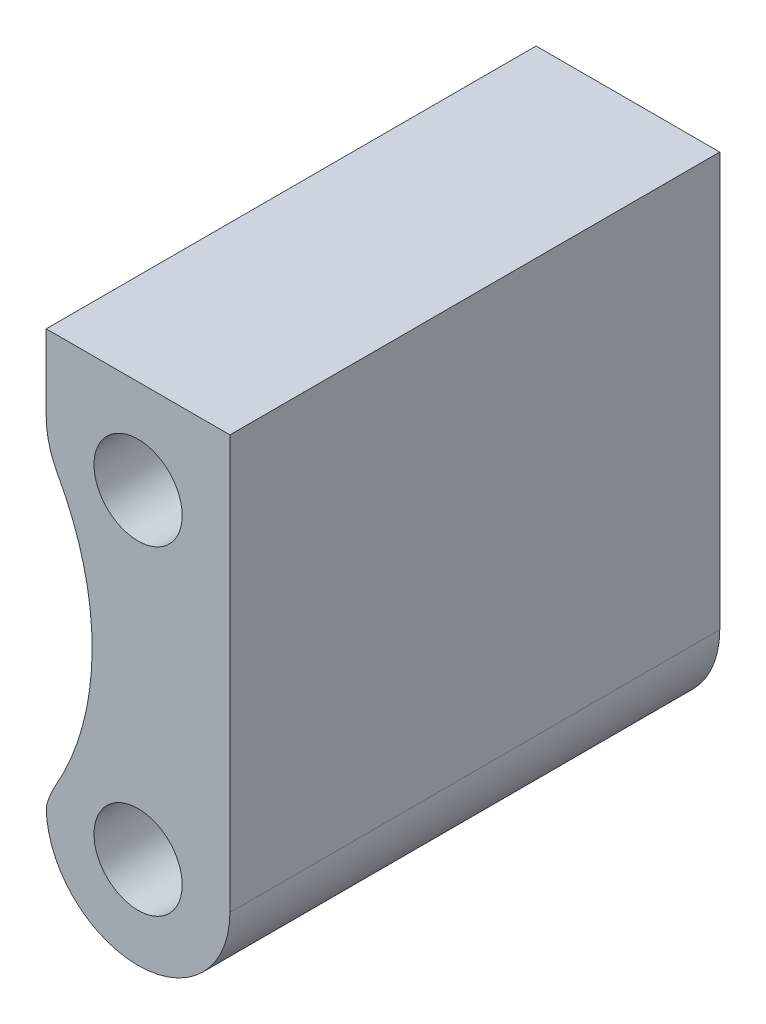
ISO-10303-21;
HEADER;
FILE_DESCRIPTION(('STEP AP214'),'2;1');
FILE_NAME('part.step','',(''),(''),'','','');
FILE_SCHEMA(('AUTOMOTIVE_DESIGN { 1 0 10303 214 1 1 1 1 }'));
ENDSEC;
DATA;
#1=APPLICATION_CONTEXT('core data for automotive mechanical design processes');
#2=APPLICATION_PROTOCOL_DEFINITION('international standard','automotive_design',2000,#1);
#3=PRODUCT_CONTEXT('',#1,'mechanical');
#4=PRODUCT('Part','Part','',(#3));
#5=PRODUCT_RELATED_PRODUCT_CATEGORY('part','',(#4));
#6=PRODUCT_DEFINITION_FORMATION('','',#4);
#7=PRODUCT_DEFINITION_CONTEXT('part definition',#1,'design');
#8=PRODUCT_DEFINITION('design','',#6,#7);
#9=PRODUCT_DEFINITION_SHAPE('','',#8);
#10=(LENGTH_UNIT() NAMED_UNIT(*) SI_UNIT(.MILLI.,.METRE.));
#11=(NAMED_UNIT(*) PLANE_ANGLE_UNIT() SI_UNIT($,.RADIAN.));
#12=(NAMED_UNIT(*) SI_UNIT($,.STERADIAN.) SOLID_ANGLE_UNIT());
#13=UNCERTAINTY_MEASURE_WITH_UNIT(LENGTH_MEASURE(1.E-05),#10,'distance_accuracy_value','');
#14=(GEOMETRIC_REPRESENTATION_CONTEXT(3) GLOBAL_UNCERTAINTY_ASSIGNED_CONTEXT((#13)) GLOBAL_UNIT_ASSIGNED_CONTEXT((#10,
#11,#12)) REPRESENTATION_CONTEXT('',''));
#15=CARTESIAN_POINT('',(0.,0.,0.));
#16=DIRECTION('',(0.,0.,1.));
#17=DIRECTION('',(1.,0.,0.));
#18=AXIS2_PLACEMENT_3D('',#15,#16,#17);
#19=CARTESIAN_POINT('',(-4.76250000000001,16.5862,25.4));
#20=DIRECTION('',(1.,0.,0.));
#21=DIRECTION('',(0.,1.,0.));
#22=AXIS2_PLACEMENT_3D('',#19,#20,#21);
#23=PLANE('',#22);
#24=DIRECTION('',(0.,-1.,0.));
#25=VECTOR('',#24,1.);
#26=CARTESIAN_POINT('',(-4.76250000000001,16.5862,0.));
#27=LINE('',#26,#25);
#28=CARTESIAN_POINT('',(-4.76250000000001,21.4477589842815,0.));
#29=VERTEX_POINT('',#28);
#30=CARTESIAN_POINT('',(-4.76250000000001,17.513345831842,0.));
#31=VERTEX_POINT('',#30);
#32=EDGE_CURVE('E186',#29,#31,#27,.T.);
#33=ORIENTED_EDGE('',*,*,#32,.T.);
#34=DIRECTION('',(0.,0.,1.));
#35=VECTOR('',#34,1.);
#36=CARTESIAN_POINT('',(-4.76250000000001,17.513345831842,25.4));
#37=LINE('',#36,#35);
#38=CARTESIAN_POINT('',(-4.76250000000001,17.513345831842,25.4));
#39=VERTEX_POINT('',#38);
#40=EDGE_CURVE('E11',#31,#39,#37,.T.);
#41=ORIENTED_EDGE('',*,*,#40,.T.);
#42=DIRECTION('',(0.,-1.,0.));
#43=VECTOR('',#42,1.);
#44=CARTESIAN_POINT('',(-4.76250000000001,16.5862,25.4));
#45=LINE('',#44,#43);
#46=CARTESIAN_POINT('',(-4.76250000000001,21.4477589842815,25.4));
#47=VERTEX_POINT('',#46);
#48=EDGE_CURVE('E129',#47,#39,#45,.T.);
#49=ORIENTED_EDGE('',*,*,#48,.F.);
#50=DIRECTION('',(0.,0.,-1.));
#51=VECTOR('',#50,1.);
#52=CARTESIAN_POINT('',(-4.76250000000001,21.4477589842815,25.4));
#53=LINE('',#52,#51);
#54=EDGE_CURVE('E127',#47,#29,#53,.T.);
#55=ORIENTED_EDGE('',*,*,#54,.T.);
#56=EDGE_LOOP('',(#33,#41,#49,#55));
#57=FACE_BOUND('',#56,.T.);
#58=ADVANCED_FACE('F44',(#57),#23,.F.);
#59=CARTESIAN_POINT('',(0.,0.,25.4));
#60=DIRECTION('',(0.,0.,1.));
#61=DIRECTION('',(1.,0.,0.));
#62=AXIS2_PLACEMENT_3D('',#59,#60,#61);
#63=PLANE('',#62);
#64=CARTESIAN_POINT('',(-16.67002,8.2931,25.4));
#65=DIRECTION('',(0.,0.,1.));
#66=DIRECTION('',(1.,0.,0.));
#67=AXIS2_PLACEMENT_3D('',#64,#65,#66);
#68=CIRCLE('',#67,14.2875);
#69=CARTESIAN_POINT('',(-4.28262603076201,1.17375123056283,25.4));
#70=VERTEX_POINT('',#69);
#71=CARTESIAN_POINT('',(-4.16750500000001,15.2082843738815,25.4));
#72=VERTEX_POINT('',#71);
#73=EDGE_CURVE('E168',#70,#72,#68,.T.);
#74=ORIENTED_EDGE('',*,*,#73,.F.);
#75=CARTESIAN_POINT('',(-0.153494707682688,-1.19936502591622,25.4));
#76=DIRECTION('',(0.,0.,1.));
#77=DIRECTION('',(1.,0.,0.));
#78=AXIS2_PLACEMENT_3D('',#75,#76,#77);
#79=CIRCLE('',#78,4.7625);
#80=CARTESIAN_POINT('',(-4.7625,0.,25.4));
#81=VERTEX_POINT('',#80);
#82=EDGE_CURVE('E53',#70,#81,#79,.T.);
#83=ORIENTED_EDGE('',*,*,#82,.T.);
#84=CARTESIAN_POINT('',(0.,0.,25.4));
#85=DIRECTION('',(0.,0.,1.));
#86=DIRECTION('',(1.,0.,0.));
#87=AXIS2_PLACEMENT_3D('',#84,#85,#86);
#88=CIRCLE('',#87,4.7625);
#89=CARTESIAN_POINT('',(4.7625,0.,25.4));
#90=VERTEX_POINT('',#89);
#91=EDGE_CURVE('E136',#81,#90,#88,.T.);
#92=ORIENTED_EDGE('',*,*,#91,.T.);
#93=DIRECTION('',(0.,1.,0.));
#94=VECTOR('',#93,1.);
#95=CARTESIAN_POINT('',(4.7625,21.4477589842815,25.4));
#96=LINE('',#95,#94);
#97=CARTESIAN_POINT('',(4.7625,21.4477589842815,25.4));
#98=VERTEX_POINT('',#97);
#99=EDGE_CURVE('E128',#90,#98,#96,.T.);
#100=ORIENTED_EDGE('',*,*,#99,.T.);
#101=DIRECTION('',(-1.,0.,0.));
#102=VECTOR('',#101,1.);
#103=CARTESIAN_POINT('',(-4.76250000000001,21.4477589842815,25.4));
#104=LINE('',#103,#102);
#105=EDGE_CURVE('E119',#98,#47,#104,.T.);
#106=ORIENTED_EDGE('',*,*,#105,.T.);
#107=ORIENTED_EDGE('',*,*,#48,.T.);
#108=CARTESIAN_POINT('',(0.,17.513345831842,25.4));
#109=DIRECTION('',(0.,0.,1.));
#110=DIRECTION('',(1.,0.,0.));
#111=AXIS2_PLACEMENT_3D('',#108,#109,#110);
#112=CIRCLE('',#111,4.7625);
#113=EDGE_CURVE('E64',#39,#72,#112,.T.);
#114=ORIENTED_EDGE('',*,*,#113,.T.);
#115=EDGE_LOOP('',(#74,#83,#92,#100,#106,#107,#114));
#116=FACE_BOUND('',#115,.T.);
#117=CARTESIAN_POINT('',(0.,0.,25.4));
#118=DIRECTION('',(0.,0.,1.));
#119=DIRECTION('',(1.,0.,0.));
#120=AXIS2_PLACEMENT_3D('',#117,#118,#119);
#121=CIRCLE('',#120,2.286);
#122=CARTESIAN_POINT('',(2.286,0.,25.4));
#123=VERTEX_POINT('',#122);
#124=EDGE_CURVE('E198',#123,#123,#121,.T.);
#125=ORIENTED_EDGE('',*,*,#124,.F.);
#126=EDGE_LOOP('',(#125));
#127=FACE_BOUND('',#126,.T.);
#128=CARTESIAN_POINT('',(0.,16.5862,25.4));
#129=DIRECTION('',(0.,0.,1.));
#130=DIRECTION('',(1.,0.,0.));
#131=AXIS2_PLACEMENT_3D('',#128,#129,#130);
#132=CIRCLE('',#131,2.286);
#133=CARTESIAN_POINT('',(2.286,16.5862,25.4));
#134=VERTEX_POINT('',#133);
#135=EDGE_CURVE('E204',#134,#134,#132,.T.);
#136=ORIENTED_EDGE('',*,*,#135,.F.);
#137=EDGE_LOOP('',(#136));
#138=FACE_BOUND('',#137,.T.);
#139=ADVANCED_FACE('F133',(#116,#127,#138),#63,.T.);
#140=CARTESIAN_POINT('',(0.,0.,0.));
#141=DIRECTION('',(0.,0.,1.));
#142=DIRECTION('',(1.,0.,0.));
#143=AXIS2_PLACEMENT_3D('',#140,#141,#142);
#144=PLANE('',#143);
#145=CARTESIAN_POINT('',(0.,0.,0.));
#146=DIRECTION('',(0.,0.,1.));
#147=DIRECTION('',(1.,0.,0.));
#148=AXIS2_PLACEMENT_3D('',#145,#146,#147);
#149=CIRCLE('',#148,4.7625);
#150=CARTESIAN_POINT('',(-4.7625,0.,0.));
#151=VERTEX_POINT('',#150);
#152=CARTESIAN_POINT('',(4.7625,0.,0.));
#153=VERTEX_POINT('',#152);
#154=EDGE_CURVE('E190',#151,#153,#149,.T.);
#155=ORIENTED_EDGE('',*,*,#154,.F.);
#156=CARTESIAN_POINT('',(-0.153494707682688,-1.19936502591622,0.));
#157=DIRECTION('',(0.,0.,1.));
#158=DIRECTION('',(1.,0.,0.));
#159=AXIS2_PLACEMENT_3D('',#156,#157,#158);
#160=CIRCLE('',#159,4.7625);
#161=CARTESIAN_POINT('',(-4.28262603076202,1.17375123056283,0.));
#162=VERTEX_POINT('',#161);
#163=EDGE_CURVE('E155',#151,#162,#160,.F.);
#164=ORIENTED_EDGE('',*,*,#163,.T.);
#165=CARTESIAN_POINT('',(-16.67002,8.2931,0.));
#166=DIRECTION('',(0.,0.,1.));
#167=DIRECTION('',(1.,0.,0.));
#168=AXIS2_PLACEMENT_3D('',#165,#166,#167);
#169=CIRCLE('',#168,14.2875);
#170=CARTESIAN_POINT('',(-4.16750500000001,15.2082843738815,0.));
#171=VERTEX_POINT('',#170);
#172=EDGE_CURVE('E215',#162,#171,#169,.T.);
#173=ORIENTED_EDGE('',*,*,#172,.T.);
#174=CARTESIAN_POINT('',(0.,17.513345831842,0.));
#175=DIRECTION('',(0.,0.,1.));
#176=DIRECTION('',(1.,0.,0.));
#177=AXIS2_PLACEMENT_3D('',#174,#175,#176);
#178=CIRCLE('',#177,4.7625);
#179=EDGE_CURVE('E150',#171,#31,#178,.F.);
#180=ORIENTED_EDGE('',*,*,#179,.T.);
#181=ORIENTED_EDGE('',*,*,#32,.F.);
#182=DIRECTION('',(-1.,0.,0.));
#183=VECTOR('',#182,1.);
#184=CARTESIAN_POINT('',(-4.76250000000001,21.4477589842815,0.));
#185=LINE('',#184,#183);
#186=CARTESIAN_POINT('',(4.7625,21.4477589842815,0.));
#187=VERTEX_POINT('',#186);
#188=EDGE_CURVE('E192',#187,#29,#185,.T.);
#189=ORIENTED_EDGE('',*,*,#188,.F.);
#190=DIRECTION('',(0.,1.,0.));
#191=VECTOR('',#190,1.);
#192=CARTESIAN_POINT('',(4.7625,16.5862,0.));
#193=LINE('',#192,#191);
#194=EDGE_CURVE('E143',#153,#187,#193,.T.);
#195=ORIENTED_EDGE('',*,*,#194,.F.);
#196=EDGE_LOOP('',(#155,#164,#173,#180,#181,#189,#195));
#197=FACE_BOUND('',#196,.T.);
#198=CARTESIAN_POINT('',(0.,0.,0.));
#199=DIRECTION('',(0.,0.,1.));
#200=DIRECTION('',(1.,0.,0.));
#201=AXIS2_PLACEMENT_3D('',#198,#199,#200);
#202=CIRCLE('',#201,2.286);
#203=CARTESIAN_POINT('',(2.286,0.,0.));
#204=VERTEX_POINT('',#203);
#205=EDGE_CURVE('E199',#204,#204,#202,.T.);
#206=ORIENTED_EDGE('',*,*,#205,.T.);
#207=EDGE_LOOP('',(#206));
#208=FACE_BOUND('',#207,.T.);
#209=CARTESIAN_POINT('',(0.,16.5862,0.));
#210=DIRECTION('',(0.,0.,1.));
#211=DIRECTION('',(1.,0.,0.));
#212=AXIS2_PLACEMENT_3D('',#209,#210,#211);
#213=CIRCLE('',#212,2.286);
#214=CARTESIAN_POINT('',(2.286,16.5862,0.));
#215=VERTEX_POINT('',#214);
#216=EDGE_CURVE('E208',#215,#215,#213,.T.);
#217=ORIENTED_EDGE('',*,*,#216,.T.);
#218=EDGE_LOOP('',(#217));
#219=FACE_BOUND('',#218,.T.);
#220=ADVANCED_FACE('F225',(#197,#208,#219),#144,.F.);
#221=CARTESIAN_POINT('',(-4.76250000000001,21.4477589842815,25.4));
#222=DIRECTION('',(0.,-1.,0.));
#223=DIRECTION('',(0.,0.,-1.));
#224=AXIS2_PLACEMENT_3D('',#221,#222,#223);
#225=PLANE('',#224);
#226=ORIENTED_EDGE('',*,*,#188,.T.);
#227=ORIENTED_EDGE('',*,*,#54,.F.);
#228=ORIENTED_EDGE('',*,*,#105,.F.);
#229=DIRECTION('',(0.,0.,-1.));
#230=VECTOR('',#229,1.);
#231=CARTESIAN_POINT('',(4.7625,21.4477589842815,25.4));
#232=LINE('',#231,#230);
#233=EDGE_CURVE('E122',#98,#187,#232,.T.);
#234=ORIENTED_EDGE('',*,*,#233,.T.);
#235=EDGE_LOOP('',(#226,#227,#228,#234));
#236=FACE_BOUND('',#235,.T.);
#237=ADVANCED_FACE('F125',(#236),#225,.F.);
#238=CARTESIAN_POINT('',(0.,0.,25.4));
#239=DIRECTION('',(0.,0.,-1.));
#240=DIRECTION('',(-1.,0.,0.));
#241=AXIS2_PLACEMENT_3D('',#238,#239,#240);
#242=CYLINDRICAL_SURFACE('',#241,4.7625);
#243=ORIENTED_EDGE('',*,*,#154,.T.);
#244=DIRECTION('',(0.,0.,-1.));
#245=VECTOR('',#244,1.);
#246=CARTESIAN_POINT('',(4.7625,0.,25.4));
#247=LINE('',#246,#245);
#248=EDGE_CURVE('E178',#90,#153,#247,.T.);
#249=ORIENTED_EDGE('',*,*,#248,.F.);
#250=ORIENTED_EDGE('',*,*,#91,.F.);
#251=DIRECTION('',(0.,0.,-1.));
#252=VECTOR('',#251,1.);
#253=CARTESIAN_POINT('',(-4.7625,0.,25.4));
#254=LINE('',#253,#252);
#255=EDGE_CURVE('E152',#81,#151,#254,.T.);
#256=ORIENTED_EDGE('',*,*,#255,.T.);
#257=EDGE_LOOP('',(#243,#249,#250,#256));
#258=FACE_BOUND('',#257,.T.);
#259=ADVANCED_FACE('F176',(#258),#242,.T.);
#260=CARTESIAN_POINT('',(4.7625,16.5862,25.4));
#261=DIRECTION('',(-1.,0.,0.));
#262=DIRECTION('',(0.,-1.,0.));
#263=AXIS2_PLACEMENT_3D('',#260,#261,#262);
#264=PLANE('',#263);
#265=ORIENTED_EDGE('',*,*,#194,.T.);
#266=ORIENTED_EDGE('',*,*,#233,.F.);
#267=ORIENTED_EDGE('',*,*,#99,.F.);
#268=ORIENTED_EDGE('',*,*,#248,.T.);
#269=EDGE_LOOP('',(#265,#266,#267,#268));
#270=FACE_BOUND('',#269,.T.);
#271=ADVANCED_FACE('F141',(#270),#264,.F.);
#272=CARTESIAN_POINT('',(0.,0.,25.4));
#273=DIRECTION('',(0.,0.,-1.));
#274=DIRECTION('',(-1.,0.,0.));
#275=AXIS2_PLACEMENT_3D('',#272,#273,#274);
#276=CYLINDRICAL_SURFACE('',#275,2.286);
#277=ORIENTED_EDGE('',*,*,#124,.T.);
#278=EDGE_LOOP('',(#277));
#279=FACE_BOUND('',#278,.T.);
#280=ORIENTED_EDGE('',*,*,#205,.F.);
#281=EDGE_LOOP('',(#280));
#282=FACE_BOUND('',#281,.T.);
#283=ADVANCED_FACE('F246',(#279,#282),#276,.F.);
#284=CARTESIAN_POINT('',(0.,16.5862,25.4));
#285=DIRECTION('',(0.,0.,-1.));
#286=DIRECTION('',(-1.,0.,0.));
#287=AXIS2_PLACEMENT_3D('',#284,#285,#286);
#288=CYLINDRICAL_SURFACE('',#287,2.286);
#289=ORIENTED_EDGE('',*,*,#135,.T.);
#290=EDGE_LOOP('',(#289));
#291=FACE_BOUND('',#290,.T.);
#292=ORIENTED_EDGE('',*,*,#216,.F.);
#293=EDGE_LOOP('',(#292));
#294=FACE_BOUND('',#293,.T.);
#295=ADVANCED_FACE('F243',(#291,#294),#288,.F.);
#296=CARTESIAN_POINT('',(-16.67002,8.2931,0.));
#297=DIRECTION('',(0.,0.,1.));
#298=DIRECTION('',(1.,0.,0.));
#299=AXIS2_PLACEMENT_3D('',#296,#297,#298);
#300=CYLINDRICAL_SURFACE('',#299,14.2875);
#301=ORIENTED_EDGE('',*,*,#172,.F.);
#302=DIRECTION('',(0.,0.,1.));
#303=VECTOR('',#302,1.);
#304=CARTESIAN_POINT('',(-4.28262603076201,1.17375123056283,0.));
#305=LINE('',#304,#303);
#306=EDGE_CURVE('E162',#162,#70,#305,.T.);
#307=ORIENTED_EDGE('',*,*,#306,.T.);
#308=ORIENTED_EDGE('',*,*,#73,.T.);
#309=DIRECTION('',(0.,0.,1.));
#310=VECTOR('',#309,1.);
#311=CARTESIAN_POINT('',(-4.167505,15.2082843738815,0.));
#312=LINE('',#311,#310);
#313=EDGE_CURVE('E159',#72,#171,#312,.F.);
#314=ORIENTED_EDGE('',*,*,#313,.T.);
#315=EDGE_LOOP('',(#301,#307,#308,#314));
#316=FACE_BOUND('',#315,.T.);
#317=ADVANCED_FACE('F240',(#316),#300,.F.);
#318=CARTESIAN_POINT('',(-0.153494707682688,-1.19936502591622,0.));
#319=DIRECTION('',(0.,0.,-1.));
#320=DIRECTION('',(-1.,0.,0.));
#321=AXIS2_PLACEMENT_3D('',#318,#319,#320);
#322=CYLINDRICAL_SURFACE('',#321,4.7625);
#323=ORIENTED_EDGE('',*,*,#82,.F.);
#324=ORIENTED_EDGE('',*,*,#306,.F.);
#325=ORIENTED_EDGE('',*,*,#163,.F.);
#326=ORIENTED_EDGE('',*,*,#255,.F.);
#327=EDGE_LOOP('',(#323,#324,#325,#326));
#328=FACE_BOUND('',#327,.T.);
#329=ADVANCED_FACE('F182',(#328),#322,.T.);
#330=CARTESIAN_POINT('',(0.,17.513345831842,0.));
#331=DIRECTION('',(0.,0.,1.));
#332=DIRECTION('',(1.,0.,0.));
#333=AXIS2_PLACEMENT_3D('',#330,#331,#332);
#334=CYLINDRICAL_SURFACE('',#333,4.7625);
#335=ORIENTED_EDGE('',*,*,#179,.F.);
#336=ORIENTED_EDGE('',*,*,#313,.F.);
#337=ORIENTED_EDGE('',*,*,#113,.F.);
#338=ORIENTED_EDGE('',*,*,#40,.F.);
#339=EDGE_LOOP('',(#335,#336,#337,#338));
#340=FACE_BOUND('',#339,.T.);
#341=ADVANCED_FACE('F50',(#340),#334,.T.);
#342=CLOSED_SHELL('',(#58,#139,#220,#237,#259,#271,#283,#295,#317,#329,#341));
#343=MANIFOLD_SOLID_BREP('B2',#342);
#344=ADVANCED_BREP_SHAPE_REPRESENTATION('',(#18,#343),#14);
#345=SHAPE_DEFINITION_REPRESENTATION(#9,#344);
ENDSEC;
END-ISO-10303-21;
